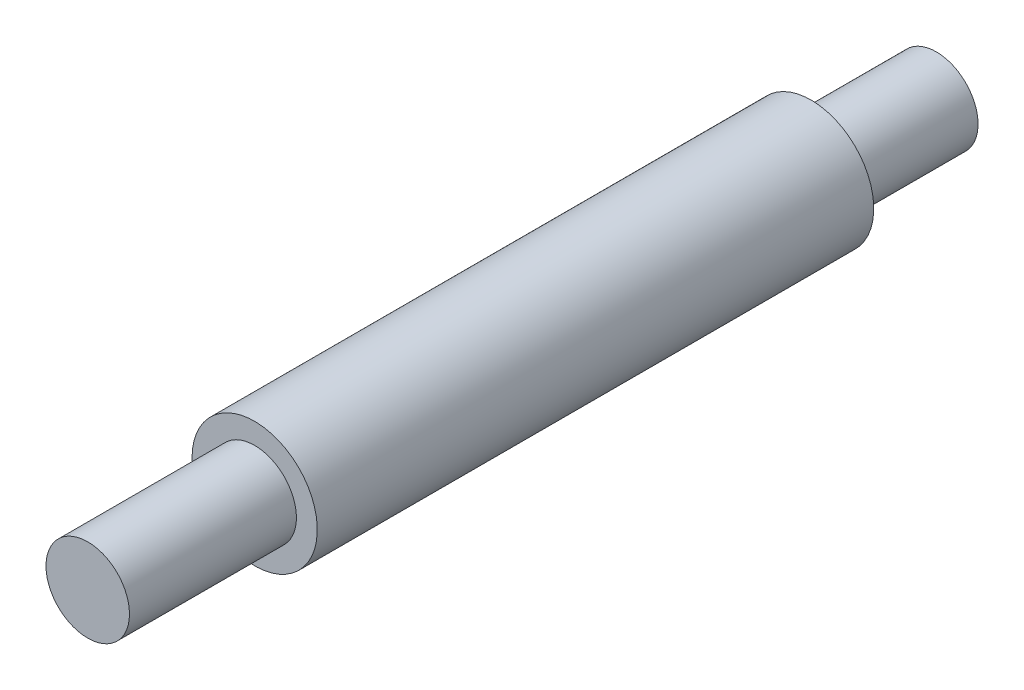
ISO-10303-21;
HEADER;
FILE_DESCRIPTION(('STEP AP214'),'2;1');
FILE_NAME('part.step','',(''),(''),'','','');
FILE_SCHEMA(('AUTOMOTIVE_DESIGN { 1 0 10303 214 1 1 1 1 }'));
ENDSEC;
DATA;
#1=APPLICATION_CONTEXT('core data for automotive mechanical design processes');
#2=APPLICATION_PROTOCOL_DEFINITION('international standard','automotive_design',2000,#1);
#3=PRODUCT_CONTEXT('',#1,'mechanical');
#4=PRODUCT('Part','Part','',(#3));
#5=PRODUCT_RELATED_PRODUCT_CATEGORY('part','',(#4));
#6=PRODUCT_DEFINITION_FORMATION('','',#4);
#7=PRODUCT_DEFINITION_CONTEXT('part definition',#1,'design');
#8=PRODUCT_DEFINITION('design','',#6,#7);
#9=PRODUCT_DEFINITION_SHAPE('','',#8);
#10=(LENGTH_UNIT() NAMED_UNIT(*) SI_UNIT(.MILLI.,.METRE.));
#11=(NAMED_UNIT(*) PLANE_ANGLE_UNIT() SI_UNIT($,.RADIAN.));
#12=(NAMED_UNIT(*) SI_UNIT($,.STERADIAN.) SOLID_ANGLE_UNIT());
#13=UNCERTAINTY_MEASURE_WITH_UNIT(LENGTH_MEASURE(1.E-05),#10,'distance_accuracy_value','');
#14=(GEOMETRIC_REPRESENTATION_CONTEXT(3) GLOBAL_UNCERTAINTY_ASSIGNED_CONTEXT((#13)) GLOBAL_UNIT_ASSIGNED_CONTEXT((#10,
#11,#12)) REPRESENTATION_CONTEXT('',''));
#15=CARTESIAN_POINT('',(0.,0.,0.));
#16=DIRECTION('',(0.,0.,1.));
#17=DIRECTION('',(1.,0.,0.));
#18=AXIS2_PLACEMENT_3D('',#15,#16,#17);
#19=CARTESIAN_POINT('',(0.,0.,-20.));
#20=DIRECTION('',(0.,0.,-1.));
#21=DIRECTION('',(-1.,0.,0.));
#22=AXIS2_PLACEMENT_3D('',#19,#20,#21);
#23=PLANE('',#22);
#24=CARTESIAN_POINT('',(0.,0.,-20.));
#25=DIRECTION('',(0.,0.,-1.));
#26=DIRECTION('',(-1.,0.,0.));
#27=AXIS2_PLACEMENT_3D('',#24,#25,#26);
#28=CIRCLE('',#27,2.25);
#29=CARTESIAN_POINT('',(-2.25,0.,-20.));
#30=VERTEX_POINT('',#29);
#31=EDGE_CURVE('E44',#30,#30,#28,.T.);
#32=ORIENTED_EDGE('',*,*,#31,.T.);
#33=EDGE_LOOP('',(#32));
#34=FACE_BOUND('',#33,.T.);
#35=CARTESIAN_POINT('',(0.,0.,-20.));
#36=DIRECTION('',(0.,0.,-1.));
#37=DIRECTION('',(-1.,0.,0.));
#38=AXIS2_PLACEMENT_3D('',#35,#36,#37);
#39=CIRCLE('',#38,1.5);
#40=CARTESIAN_POINT('',(-1.5,0.,-20.));
#41=VERTEX_POINT('',#40);
#42=EDGE_CURVE('E54',#41,#41,#39,.T.);
#43=ORIENTED_EDGE('',*,*,#42,.F.);
#44=EDGE_LOOP('',(#43));
#45=FACE_BOUND('',#44,.T.);
#46=ADVANCED_FACE('F33',(#34,#45),#23,.T.);
#47=CARTESIAN_POINT('',(0.,0.,6.));
#48=DIRECTION('',(0.,0.,-1.));
#49=DIRECTION('',(-1.,0.,0.));
#50=AXIS2_PLACEMENT_3D('',#47,#48,#49);
#51=CYLINDRICAL_SURFACE('',#50,1.5);
#52=CARTESIAN_POINT('',(0.,0.,6.));
#53=DIRECTION('',(0.,0.,1.));
#54=DIRECTION('',(1.,0.,0.));
#55=AXIS2_PLACEMENT_3D('',#52,#53,#54);
#56=CIRCLE('',#55,1.5);
#57=CARTESIAN_POINT('',(1.5,0.,6.));
#58=VERTEX_POINT('',#57);
#59=EDGE_CURVE('E10',#58,#58,#56,.T.);
#60=ORIENTED_EDGE('',*,*,#59,.F.);
#61=EDGE_LOOP('',(#60));
#62=FACE_BOUND('',#61,.T.);
#63=CARTESIAN_POINT('',(0.,0.,0.));
#64=DIRECTION('',(0.,0.,-1.));
#65=DIRECTION('',(-1.,0.,0.));
#66=AXIS2_PLACEMENT_3D('',#63,#64,#65);
#67=CIRCLE('',#66,1.5);
#68=CARTESIAN_POINT('',(-1.5,0.,0.));
#69=VERTEX_POINT('',#68);
#70=EDGE_CURVE('E40',#69,#69,#67,.T.);
#71=ORIENTED_EDGE('',*,*,#70,.F.);
#72=EDGE_LOOP('',(#71));
#73=FACE_BOUND('',#72,.T.);
#74=ADVANCED_FACE('F35',(#62,#73),#51,.T.);
#75=CARTESIAN_POINT('',(0.,0.,6.));
#76=DIRECTION('',(0.,0.,1.));
#77=DIRECTION('',(1.,0.,0.));
#78=AXIS2_PLACEMENT_3D('',#75,#76,#77);
#79=PLANE('',#78);
#80=ORIENTED_EDGE('',*,*,#59,.T.);
#81=EDGE_LOOP('',(#80));
#82=FACE_BOUND('',#81,.T.);
#83=ADVANCED_FACE('F75',(#82),#79,.T.);
#84=CARTESIAN_POINT('',(0.,0.,0.));
#85=DIRECTION('',(0.,0.,-1.));
#86=DIRECTION('',(-1.,0.,0.));
#87=AXIS2_PLACEMENT_3D('',#84,#85,#86);
#88=PLANE('',#87);
#89=CARTESIAN_POINT('',(0.,0.,0.));
#90=DIRECTION('',(0.,0.,-1.));
#91=DIRECTION('',(-1.,0.,0.));
#92=AXIS2_PLACEMENT_3D('',#89,#90,#91);
#93=CIRCLE('',#92,2.25);
#94=CARTESIAN_POINT('',(-2.25,0.,0.));
#95=VERTEX_POINT('',#94);
#96=EDGE_CURVE('E48',#95,#95,#93,.T.);
#97=ORIENTED_EDGE('',*,*,#96,.F.);
#98=EDGE_LOOP('',(#97));
#99=FACE_BOUND('',#98,.T.);
#100=ORIENTED_EDGE('',*,*,#70,.T.);
#101=EDGE_LOOP('',(#100));
#102=FACE_BOUND('',#101,.T.);
#103=ADVANCED_FACE('F79',(#99,#102),#88,.F.);
#104=CARTESIAN_POINT('',(0.,0.,-20.));
#105=DIRECTION('',(0.,0.,1.));
#106=DIRECTION('',(1.,0.,0.));
#107=AXIS2_PLACEMENT_3D('',#104,#105,#106);
#108=CYLINDRICAL_SURFACE('',#107,2.25);
#109=ORIENTED_EDGE('',*,*,#31,.F.);
#110=EDGE_LOOP('',(#109));
#111=FACE_BOUND('',#110,.T.);
#112=ORIENTED_EDGE('',*,*,#96,.T.);
#113=EDGE_LOOP('',(#112));
#114=FACE_BOUND('',#113,.T.);
#115=ADVANCED_FACE('F65',(#111,#114),#108,.T.);
#116=CARTESIAN_POINT('',(0.,0.,-24.5));
#117=DIRECTION('',(0.,0.,1.));
#118=DIRECTION('',(1.,0.,0.));
#119=AXIS2_PLACEMENT_3D('',#116,#117,#118);
#120=CYLINDRICAL_SURFACE('',#119,1.5);
#121=CARTESIAN_POINT('',(0.,0.,-24.5));
#122=DIRECTION('',(0.,0.,-1.));
#123=DIRECTION('',(-1.,0.,0.));
#124=AXIS2_PLACEMENT_3D('',#121,#122,#123);
#125=CIRCLE('',#124,1.5);
#126=CARTESIAN_POINT('',(-1.5,0.,-24.5));
#127=VERTEX_POINT('',#126);
#128=EDGE_CURVE('E52',#127,#127,#125,.T.);
#129=ORIENTED_EDGE('',*,*,#128,.F.);
#130=EDGE_LOOP('',(#129));
#131=FACE_BOUND('',#130,.T.);
#132=ORIENTED_EDGE('',*,*,#42,.T.);
#133=EDGE_LOOP('',(#132));
#134=FACE_BOUND('',#133,.T.);
#135=ADVANCED_FACE('F62',(#131,#134),#120,.T.);
#136=CARTESIAN_POINT('',(0.,0.,-24.5));
#137=DIRECTION('',(0.,0.,-1.));
#138=DIRECTION('',(-1.,0.,0.));
#139=AXIS2_PLACEMENT_3D('',#136,#137,#138);
#140=PLANE('',#139);
#141=ORIENTED_EDGE('',*,*,#128,.T.);
#142=EDGE_LOOP('',(#141));
#143=FACE_BOUND('',#142,.T.);
#144=ADVANCED_FACE('F60',(#143),#140,.T.);
#145=CLOSED_SHELL('',(#46,#74,#83,#103,#115,#135,#144));
#146=MANIFOLD_SOLID_BREP('B2',#145);
#147=ADVANCED_BREP_SHAPE_REPRESENTATION('',(#18,#146),#14);
#148=SHAPE_DEFINITION_REPRESENTATION(#9,#147);
ENDSEC;
END-ISO-10303-21;
